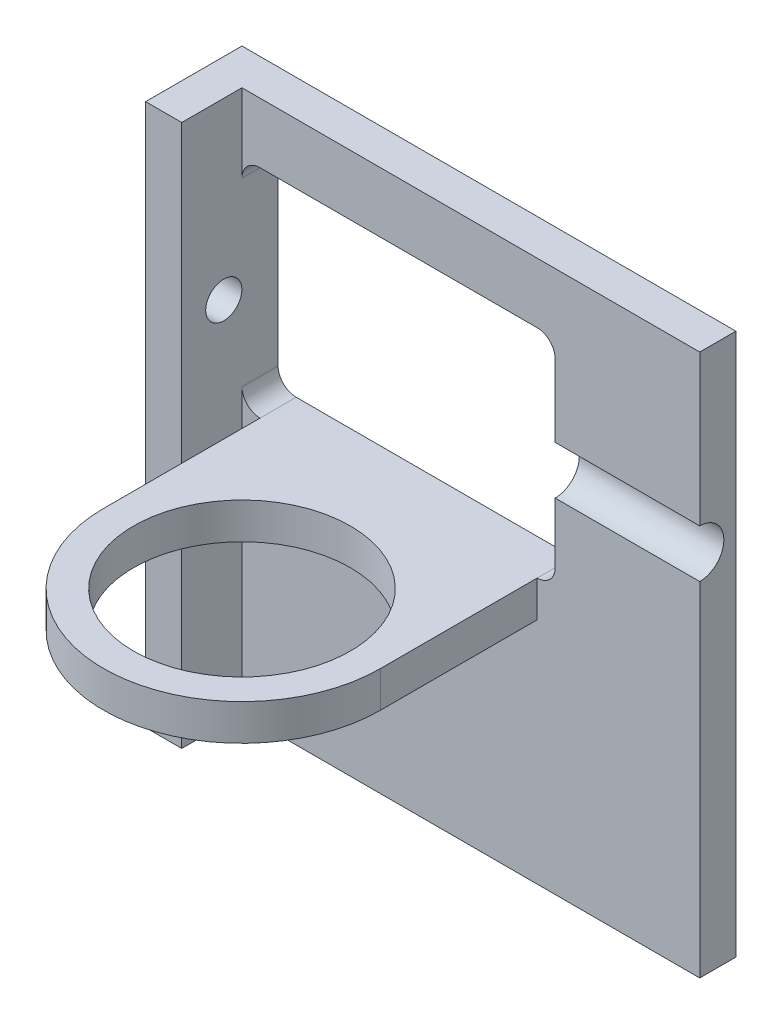
ISO-10303-21;
HEADER;
FILE_DESCRIPTION(('STEP AP214'),'2;1');
FILE_NAME('part.step','',(''),(''),'','','');
FILE_SCHEMA(('AUTOMOTIVE_DESIGN { 1 0 10303 214 1 1 1 1 }'));
ENDSEC;
DATA;
#1=APPLICATION_CONTEXT('core data for automotive mechanical design processes');
#2=APPLICATION_PROTOCOL_DEFINITION('international standard','automotive_design',2000,#1);
#3=PRODUCT_CONTEXT('',#1,'mechanical');
#4=PRODUCT('Part','Part','',(#3));
#5=PRODUCT_RELATED_PRODUCT_CATEGORY('part','',(#4));
#6=PRODUCT_DEFINITION_FORMATION('','',#4);
#7=PRODUCT_DEFINITION_CONTEXT('part definition',#1,'design');
#8=PRODUCT_DEFINITION('design','',#6,#7);
#9=PRODUCT_DEFINITION_SHAPE('','',#8);
#10=(LENGTH_UNIT() NAMED_UNIT(*) SI_UNIT(.MILLI.,.METRE.));
#11=(NAMED_UNIT(*) PLANE_ANGLE_UNIT() SI_UNIT($,.RADIAN.));
#12=(NAMED_UNIT(*) SI_UNIT($,.STERADIAN.) SOLID_ANGLE_UNIT());
#13=UNCERTAINTY_MEASURE_WITH_UNIT(LENGTH_MEASURE(1.E-05),#10,'distance_accuracy_value','');
#14=(GEOMETRIC_REPRESENTATION_CONTEXT(3) GLOBAL_UNCERTAINTY_ASSIGNED_CONTEXT((#13)) GLOBAL_UNIT_ASSIGNED_CONTEXT((#10,
#11,#12)) REPRESENTATION_CONTEXT('',''));
#15=CARTESIAN_POINT('',(0.,0.,0.));
#16=DIRECTION('',(0.,0.,1.));
#17=DIRECTION('',(1.,0.,0.));
#18=AXIS2_PLACEMENT_3D('',#15,#16,#17);
#19=CARTESIAN_POINT('',(0.,0.,3.));
#20=DIRECTION('',(0.,0.,1.));
#21=DIRECTION('',(1.,0.,0.));
#22=AXIS2_PLACEMENT_3D('',#19,#20,#21);
#23=PLANE('',#22);
#24=DIRECTION('',(1.,0.,0.));
#25=VECTOR('',#24,1.);
#26=CARTESIAN_POINT('',(24.5278640450004,-16.5,3.));
#27=LINE('',#26,#25);
#28=CARTESIAN_POINT('',(29.,-16.5,3.));
#29=VERTEX_POINT('',#28);
#30=CARTESIAN_POINT('',(41.,-16.5,3.));
#31=VERTEX_POINT('',#30);
#32=EDGE_CURVE('E171',#29,#31,#27,.T.);
#33=ORIENTED_EDGE('',*,*,#32,.F.);
#34=DIRECTION('',(0.,1.,0.));
#35=VECTOR('',#34,1.);
#36=CARTESIAN_POINT('',(29.,-21.5,3.));
#37=LINE('',#36,#35);
#38=CARTESIAN_POINT('',(29.,-21.5,3.));
#39=VERTEX_POINT('',#38);
#40=EDGE_CURVE('E291',#39,#29,#37,.T.);
#41=ORIENTED_EDGE('',*,*,#40,.F.);
#42=CARTESIAN_POINT('',(27.5,-21.5,3.));
#43=DIRECTION('',(0.,0.,1.));
#44=DIRECTION('',(-1.,0.,0.));
#45=AXIS2_PLACEMENT_3D('',#42,#43,#44);
#46=CIRCLE('',#45,1.5);
#47=CARTESIAN_POINT('',(27.5,-23.,3.));
#48=VERTEX_POINT('',#47);
#49=EDGE_CURVE('E294',#48,#39,#46,.T.);
#50=ORIENTED_EDGE('',*,*,#49,.F.);
#51=DIRECTION('',(0.,1.,0.));
#52=VECTOR('',#51,1.);
#53=CARTESIAN_POINT('',(27.5,-26.,3.));
#54=LINE('',#53,#52);
#55=CARTESIAN_POINT('',(27.5,-26.,3.));
#56=VERTEX_POINT('',#55);
#57=EDGE_CURVE('E323',#56,#48,#54,.T.);
#58=ORIENTED_EDGE('',*,*,#57,.F.);
#59=DIRECTION('',(-1.,0.,0.));
#60=VECTOR('',#59,1.);
#61=CARTESIAN_POINT('',(0.,-26.,3.));
#62=LINE('',#61,#60);
#63=CARTESIAN_POINT('',(4.50000000000002,-26.,3.));
#64=VERTEX_POINT('',#63);
#65=EDGE_CURVE('E321',#56,#64,#62,.T.);
#66=ORIENTED_EDGE('',*,*,#65,.T.);
#67=DIRECTION('',(0.,1.,0.));
#68=VECTOR('',#67,1.);
#69=CARTESIAN_POINT('',(4.50000000000002,-26.,3.));
#70=LINE('',#69,#68);
#71=CARTESIAN_POINT('',(4.50000000000002,-23.,3.));
#72=VERTEX_POINT('',#71);
#73=EDGE_CURVE('E315',#64,#72,#70,.T.);
#74=ORIENTED_EDGE('',*,*,#73,.T.);
#75=CARTESIAN_POINT('',(4.50000000000001,-21.5,3.));
#76=DIRECTION('',(0.,0.,1.));
#77=DIRECTION('',(-1.,0.,0.));
#78=AXIS2_PLACEMENT_3D('',#75,#76,#77);
#79=CIRCLE('',#78,1.5);
#80=CARTESIAN_POINT('',(3.00000000000001,-21.5,3.));
#81=VERTEX_POINT('',#80);
#82=EDGE_CURVE('E296',#81,#72,#79,.T.);
#83=ORIENTED_EDGE('',*,*,#82,.F.);
#84=DIRECTION('',(0.,1.,0.));
#85=VECTOR('',#84,1.);
#86=CARTESIAN_POINT('',(3.,0.,3.));
#87=LINE('',#86,#85);
#88=CARTESIAN_POINT('',(3.,-45.,3.));
#89=VERTEX_POINT('',#88);
#90=EDGE_CURVE('E47',#89,#81,#87,.T.);
#91=ORIENTED_EDGE('',*,*,#90,.F.);
#92=DIRECTION('',(1.,0.,0.));
#93=VECTOR('',#92,1.);
#94=CARTESIAN_POINT('',(0.,-45.,3.));
#95=LINE('',#94,#93);
#96=CARTESIAN_POINT('',(41.,-45.,3.));
#97=VERTEX_POINT('',#96);
#98=EDGE_CURVE('E191',#89,#97,#95,.T.);
#99=ORIENTED_EDGE('',*,*,#98,.T.);
#100=DIRECTION('',(0.,1.,0.));
#101=VECTOR('',#100,1.);
#102=CARTESIAN_POINT('',(41.,0.,3.));
#103=LINE('',#102,#101);
#104=EDGE_CURVE('E190',#97,#31,#103,.T.);
#105=ORIENTED_EDGE('',*,*,#104,.T.);
#106=EDGE_LOOP('',(#33,#41,#50,#58,#66,#74,#83,#91,#99,#105));
#107=FACE_BOUND('',#106,.T.);
#108=ADVANCED_FACE('F37',(#107),#23,.T.);
#109=DIRECTION('',(1.,0.,0.));
#110=VECTOR('',#109,1.);
#111=CARTESIAN_POINT('',(24.5278640450004,-12.5,3.));
#112=LINE('',#111,#110);
#113=CARTESIAN_POINT('',(29.,-12.5,3.));
#114=VERTEX_POINT('',#113);
#115=CARTESIAN_POINT('',(41.,-12.5,3.));
#116=VERTEX_POINT('',#115);
#117=EDGE_CURVE('E54',#114,#116,#112,.T.);
#118=ORIENTED_EDGE('',*,*,#117,.T.);
#119=CARTESIAN_POINT('',(41.,0.,3.));
#120=VERTEX_POINT('',#119);
#121=EDGE_CURVE('E181',#116,#120,#103,.T.);
#122=ORIENTED_EDGE('',*,*,#121,.T.);
#123=DIRECTION('',(-1.,0.,0.));
#124=VECTOR('',#123,1.);
#125=CARTESIAN_POINT('',(0.,0.,3.));
#126=LINE('',#125,#124);
#127=CARTESIAN_POINT('',(3.,0.,3.));
#128=VERTEX_POINT('',#127);
#129=EDGE_CURVE('E193',#120,#128,#126,.T.);
#130=ORIENTED_EDGE('',*,*,#129,.T.);
#131=CARTESIAN_POINT('',(3.00000000000001,-6.50000000000002,3.));
#132=VERTEX_POINT('',#131);
#133=EDGE_CURVE('E11',#132,#128,#87,.T.);
#134=ORIENTED_EDGE('',*,*,#133,.F.);
#135=CARTESIAN_POINT('',(4.50000000000001,-6.5,3.));
#136=DIRECTION('',(0.,0.,1.));
#137=DIRECTION('',(1.,0.,0.));
#138=AXIS2_PLACEMENT_3D('',#135,#136,#137);
#139=CIRCLE('',#138,1.5);
#140=CARTESIAN_POINT('',(4.50000000000002,-5.,3.));
#141=VERTEX_POINT('',#140);
#142=EDGE_CURVE('E267',#141,#132,#139,.T.);
#143=ORIENTED_EDGE('',*,*,#142,.F.);
#144=DIRECTION('',(-1.,0.,0.));
#145=VECTOR('',#144,1.);
#146=CARTESIAN_POINT('',(27.5,-5.,3.));
#147=LINE('',#146,#145);
#148=CARTESIAN_POINT('',(27.5,-5.,3.));
#149=VERTEX_POINT('',#148);
#150=EDGE_CURVE('E263',#149,#141,#147,.T.);
#151=ORIENTED_EDGE('',*,*,#150,.F.);
#152=CARTESIAN_POINT('',(27.5,-6.5,3.));
#153=DIRECTION('',(0.,0.,1.));
#154=DIRECTION('',(1.,0.,0.));
#155=AXIS2_PLACEMENT_3D('',#152,#153,#154);
#156=CIRCLE('',#155,1.5);
#157=CARTESIAN_POINT('',(29.,-6.50000000000001,3.));
#158=VERTEX_POINT('',#157);
#159=EDGE_CURVE('E288',#158,#149,#156,.T.);
#160=ORIENTED_EDGE('',*,*,#159,.F.);
#161=EDGE_CURVE('E184',#114,#158,#37,.T.);
#162=ORIENTED_EDGE('',*,*,#161,.F.);
#163=EDGE_LOOP('',(#118,#122,#130,#134,#143,#151,#160,#162));
#164=FACE_BOUND('',#163,.T.);
#165=ADVANCED_FACE('F180',(#164),#23,.T.);
#166=CARTESIAN_POINT('',(0.,0.,0.));
#167=DIRECTION('',(0.,0.,1.));
#168=DIRECTION('',(1.,0.,0.));
#169=AXIS2_PLACEMENT_3D('',#166,#167,#168);
#170=PLANE('',#169);
#171=DIRECTION('',(0.,-1.,0.));
#172=VECTOR('',#171,1.);
#173=CARTESIAN_POINT('',(0.,0.,0.));
#174=LINE('',#173,#172);
#175=CARTESIAN_POINT('',(0.,0.,0.));
#176=VERTEX_POINT('',#175);
#177=CARTESIAN_POINT('',(0.,-45.,0.));
#178=VERTEX_POINT('',#177);
#179=EDGE_CURVE('E200',#176,#178,#174,.T.);
#180=ORIENTED_EDGE('',*,*,#179,.F.);
#181=DIRECTION('',(-1.,0.,0.));
#182=VECTOR('',#181,1.);
#183=CARTESIAN_POINT('',(0.,0.,0.));
#184=LINE('',#183,#182);
#185=CARTESIAN_POINT('',(41.,0.,0.));
#186=VERTEX_POINT('',#185);
#187=EDGE_CURVE('E194',#186,#176,#184,.T.);
#188=ORIENTED_EDGE('',*,*,#187,.F.);
#189=DIRECTION('',(0.,1.,0.));
#190=VECTOR('',#189,1.);
#191=CARTESIAN_POINT('',(41.,0.,0.));
#192=LINE('',#191,#190);
#193=CARTESIAN_POINT('',(41.,-45.,0.));
#194=VERTEX_POINT('',#193);
#195=EDGE_CURVE('E206',#194,#186,#192,.T.);
#196=ORIENTED_EDGE('',*,*,#195,.F.);
#197=DIRECTION('',(1.,0.,0.));
#198=VECTOR('',#197,1.);
#199=CARTESIAN_POINT('',(0.,-45.,0.));
#200=LINE('',#199,#198);
#201=EDGE_CURVE('E203',#178,#194,#200,.T.);
#202=ORIENTED_EDGE('',*,*,#201,.F.);
#203=EDGE_LOOP('',(#180,#188,#196,#202));
#204=FACE_BOUND('',#203,.T.);
#205=CARTESIAN_POINT('',(4.50000000000001,-6.5,0.));
#206=DIRECTION('',(0.,0.,1.));
#207=DIRECTION('',(1.,0.,0.));
#208=AXIS2_PLACEMENT_3D('',#205,#206,#207);
#209=CIRCLE('',#208,1.5);
#210=CARTESIAN_POINT('',(4.50000000000002,-5.,0.));
#211=VERTEX_POINT('',#210);
#212=CARTESIAN_POINT('',(3.00000000000001,-6.50000000000002,0.));
#213=VERTEX_POINT('',#212);
#214=EDGE_CURVE('E284',#211,#213,#209,.T.);
#215=ORIENTED_EDGE('',*,*,#214,.T.);
#216=DIRECTION('',(0.,-1.,0.));
#217=VECTOR('',#216,1.);
#218=CARTESIAN_POINT('',(3.00000000000001,-21.5,0.));
#219=LINE('',#218,#217);
#220=CARTESIAN_POINT('',(3.00000000000001,-21.5,0.));
#221=VERTEX_POINT('',#220);
#222=EDGE_CURVE('E244',#213,#221,#219,.T.);
#223=ORIENTED_EDGE('',*,*,#222,.T.);
#224=CARTESIAN_POINT('',(4.50000000000001,-21.5,0.));
#225=DIRECTION('',(0.,0.,1.));
#226=DIRECTION('',(-1.,0.,0.));
#227=AXIS2_PLACEMENT_3D('',#224,#225,#226);
#228=CIRCLE('',#227,1.5);
#229=CARTESIAN_POINT('',(4.50000000000002,-23.,0.));
#230=VERTEX_POINT('',#229);
#231=EDGE_CURVE('E280',#221,#230,#228,.T.);
#232=ORIENTED_EDGE('',*,*,#231,.T.);
#233=DIRECTION('',(1.,0.,0.));
#234=VECTOR('',#233,1.);
#235=CARTESIAN_POINT('',(27.5,-23.,0.));
#236=LINE('',#235,#234);
#237=CARTESIAN_POINT('',(27.5,-23.,0.));
#238=VERTEX_POINT('',#237);
#239=EDGE_CURVE('E277',#230,#238,#236,.T.);
#240=ORIENTED_EDGE('',*,*,#239,.T.);
#241=CARTESIAN_POINT('',(27.5,-21.5,0.));
#242=DIRECTION('',(0.,0.,1.));
#243=DIRECTION('',(-1.,0.,0.));
#244=AXIS2_PLACEMENT_3D('',#241,#242,#243);
#245=CIRCLE('',#244,1.5);
#246=CARTESIAN_POINT('',(29.,-21.5,0.));
#247=VERTEX_POINT('',#246);
#248=EDGE_CURVE('E274',#238,#247,#245,.T.);
#249=ORIENTED_EDGE('',*,*,#248,.T.);
#250=DIRECTION('',(0.,1.,0.));
#251=VECTOR('',#250,1.);
#252=CARTESIAN_POINT('',(29.,-21.5,0.));
#253=LINE('',#252,#251);
#254=CARTESIAN_POINT('',(29.,-6.50000000000001,0.));
#255=VERTEX_POINT('',#254);
#256=EDGE_CURVE('E271',#247,#255,#253,.T.);
#257=ORIENTED_EDGE('',*,*,#256,.T.);
#258=CARTESIAN_POINT('',(27.5,-6.5,0.));
#259=DIRECTION('',(0.,0.,1.));
#260=DIRECTION('',(1.,0.,0.));
#261=AXIS2_PLACEMENT_3D('',#258,#259,#260);
#262=CIRCLE('',#261,1.5);
#263=CARTESIAN_POINT('',(27.5,-5.,0.));
#264=VERTEX_POINT('',#263);
#265=EDGE_CURVE('E268',#255,#264,#262,.T.);
#266=ORIENTED_EDGE('',*,*,#265,.T.);
#267=DIRECTION('',(-1.,0.,0.));
#268=VECTOR('',#267,1.);
#269=CARTESIAN_POINT('',(27.5,-5.,0.));
#270=LINE('',#269,#268);
#271=EDGE_CURVE('E264',#264,#211,#270,.T.);
#272=ORIENTED_EDGE('',*,*,#271,.T.);
#273=EDGE_LOOP('',(#215,#223,#232,#240,#249,#257,#266,#272));
#274=FACE_BOUND('',#273,.T.);
#275=ADVANCED_FACE('F229',(#204,#274),#170,.F.);
#276=CARTESIAN_POINT('',(0.,0.,3.));
#277=DIRECTION('',(1.,0.,0.));
#278=DIRECTION('',(0.,1.,0.));
#279=AXIS2_PLACEMENT_3D('',#276,#277,#278);
#280=PLANE('',#279);
#281=ORIENTED_EDGE('',*,*,#179,.T.);
#282=DIRECTION('',(0.,0.,-1.));
#283=VECTOR('',#282,1.);
#284=CARTESIAN_POINT('',(0.,-45.,3.));
#285=LINE('',#284,#283);
#286=CARTESIAN_POINT('',(0.,-45.,7.99999999999999));
#287=VERTEX_POINT('',#286);
#288=EDGE_CURVE('E41',#287,#178,#285,.T.);
#289=ORIENTED_EDGE('',*,*,#288,.F.);
#290=DIRECTION('',(0.,-1.,0.));
#291=VECTOR('',#290,1.);
#292=CARTESIAN_POINT('',(0.,0.,8.));
#293=LINE('',#292,#291);
#294=CARTESIAN_POINT('',(0.,0.,8.));
#295=VERTEX_POINT('',#294);
#296=EDGE_CURVE('E304',#295,#287,#293,.T.);
#297=ORIENTED_EDGE('',*,*,#296,.F.);
#298=DIRECTION('',(0.,0.,-1.));
#299=VECTOR('',#298,1.);
#300=CARTESIAN_POINT('',(0.,0.,3.));
#301=LINE('',#300,#299);
#302=EDGE_CURVE('E199',#295,#176,#301,.T.);
#303=ORIENTED_EDGE('',*,*,#302,.T.);
#304=EDGE_LOOP('',(#281,#289,#297,#303));
#305=FACE_BOUND('',#304,.T.);
#306=CARTESIAN_POINT('',(0.,-14.5,4.51));
#307=DIRECTION('',(1.,0.,0.));
#308=DIRECTION('',(0.,0.,-1.));
#309=AXIS2_PLACEMENT_3D('',#306,#307,#308);
#310=CIRCLE('',#309,1.5);
#311=CARTESIAN_POINT('',(0.,-14.5,3.01));
#312=VERTEX_POINT('',#311);
#313=EDGE_CURVE('E312',#312,#312,#310,.T.);
#314=ORIENTED_EDGE('',*,*,#313,.T.);
#315=EDGE_LOOP('',(#314));
#316=FACE_BOUND('',#315,.T.);
#317=ADVANCED_FACE('F39',(#305,#316),#280,.F.);
#318=CARTESIAN_POINT('',(0.,-45.,3.));
#319=DIRECTION('',(0.,1.,0.));
#320=DIRECTION('',(0.,0.,1.));
#321=AXIS2_PLACEMENT_3D('',#318,#319,#320);
#322=PLANE('',#321);
#323=ORIENTED_EDGE('',*,*,#201,.T.);
#324=DIRECTION('',(0.,0.,-1.));
#325=VECTOR('',#324,1.);
#326=CARTESIAN_POINT('',(41.,-45.,3.));
#327=LINE('',#326,#325);
#328=EDGE_CURVE('E211',#97,#194,#327,.T.);
#329=ORIENTED_EDGE('',*,*,#328,.F.);
#330=ORIENTED_EDGE('',*,*,#98,.F.);
#331=DIRECTION('',(0.,0.,-1.));
#332=VECTOR('',#331,1.);
#333=CARTESIAN_POINT('',(3.,-45.,3.));
#334=LINE('',#333,#332);
#335=CARTESIAN_POINT('',(3.,-45.,7.99999999999999));
#336=VERTEX_POINT('',#335);
#337=EDGE_CURVE('E303',#336,#89,#334,.T.);
#338=ORIENTED_EDGE('',*,*,#337,.F.);
#339=DIRECTION('',(-1.,0.,0.));
#340=VECTOR('',#339,1.);
#341=CARTESIAN_POINT('',(3.,-45.,7.99999999999999));
#342=LINE('',#341,#340);
#343=EDGE_CURVE('E221',#336,#287,#342,.T.);
#344=ORIENTED_EDGE('',*,*,#343,.T.);
#345=ORIENTED_EDGE('',*,*,#288,.T.);
#346=EDGE_LOOP('',(#323,#329,#330,#338,#344,#345));
#347=FACE_BOUND('',#346,.T.);
#348=ADVANCED_FACE('F218',(#347),#322,.F.);
#349=CARTESIAN_POINT('',(41.,0.,3.));
#350=DIRECTION('',(-1.,0.,0.));
#351=DIRECTION('',(0.,-1.,0.));
#352=AXIS2_PLACEMENT_3D('',#349,#350,#351);
#353=PLANE('',#352);
#354=ORIENTED_EDGE('',*,*,#121,.F.);
#355=CARTESIAN_POINT('',(41.,-14.5,3.));
#356=DIRECTION('',(1.,0.,0.));
#357=DIRECTION('',(0.,1.,0.));
#358=AXIS2_PLACEMENT_3D('',#355,#356,#357);
#359=CIRCLE('',#358,2.);
#360=EDGE_CURVE('E168',#31,#116,#359,.T.);
#361=ORIENTED_EDGE('',*,*,#360,.F.);
#362=ORIENTED_EDGE('',*,*,#104,.F.);
#363=ORIENTED_EDGE('',*,*,#328,.T.);
#364=ORIENTED_EDGE('',*,*,#195,.T.);
#365=DIRECTION('',(0.,0.,-1.));
#366=VECTOR('',#365,1.);
#367=CARTESIAN_POINT('',(41.,0.,3.));
#368=LINE('',#367,#366);
#369=EDGE_CURVE('E188',#120,#186,#368,.T.);
#370=ORIENTED_EDGE('',*,*,#369,.F.);
#371=EDGE_LOOP('',(#354,#361,#362,#363,#364,#370));
#372=FACE_BOUND('',#371,.T.);
#373=ADVANCED_FACE('F186',(#372),#353,.F.);
#374=CARTESIAN_POINT('',(0.,0.,3.));
#375=DIRECTION('',(0.,-1.,0.));
#376=DIRECTION('',(0.,0.,-1.));
#377=AXIS2_PLACEMENT_3D('',#374,#375,#376);
#378=PLANE('',#377);
#379=ORIENTED_EDGE('',*,*,#187,.T.);
#380=ORIENTED_EDGE('',*,*,#302,.F.);
#381=DIRECTION('',(-1.,0.,0.));
#382=VECTOR('',#381,1.);
#383=CARTESIAN_POINT('',(3.,0.,8.));
#384=LINE('',#383,#382);
#385=CARTESIAN_POINT('',(3.,0.,8.));
#386=VERTEX_POINT('',#385);
#387=EDGE_CURVE('E286',#386,#295,#384,.T.);
#388=ORIENTED_EDGE('',*,*,#387,.F.);
#389=DIRECTION('',(0.,0.,1.));
#390=VECTOR('',#389,1.);
#391=CARTESIAN_POINT('',(3.,0.,3.));
#392=LINE('',#391,#390);
#393=EDGE_CURVE('E235',#128,#386,#392,.T.);
#394=ORIENTED_EDGE('',*,*,#393,.F.);
#395=ORIENTED_EDGE('',*,*,#129,.F.);
#396=ORIENTED_EDGE('',*,*,#369,.T.);
#397=EDGE_LOOP('',(#379,#380,#388,#394,#395,#396));
#398=FACE_BOUND('',#397,.T.);
#399=ADVANCED_FACE('F232',(#398),#378,.F.);
#400=CARTESIAN_POINT('',(4.50000000000001,-6.5,3.));
#401=DIRECTION('',(0.,0.,-1.));
#402=DIRECTION('',(-1.,0.,0.));
#403=AXIS2_PLACEMENT_3D('',#400,#401,#402);
#404=CYLINDRICAL_SURFACE('',#403,1.5);
#405=ORIENTED_EDGE('',*,*,#214,.F.);
#406=DIRECTION('',(0.,0.,-1.));
#407=VECTOR('',#406,1.);
#408=CARTESIAN_POINT('',(4.50000000000002,-5.,3.));
#409=LINE('',#408,#407);
#410=EDGE_CURVE('E260',#141,#211,#409,.T.);
#411=ORIENTED_EDGE('',*,*,#410,.F.);
#412=ORIENTED_EDGE('',*,*,#142,.T.);
#413=DIRECTION('',(0.,0.,-1.));
#414=VECTOR('',#413,1.);
#415=CARTESIAN_POINT('',(3.00000000000001,-6.50000000000002,3.));
#416=LINE('',#415,#414);
#417=EDGE_CURVE('E204',#132,#213,#416,.T.);
#418=ORIENTED_EDGE('',*,*,#417,.T.);
#419=EDGE_LOOP('',(#405,#411,#412,#418));
#420=FACE_BOUND('',#419,.T.);
#421=ADVANCED_FACE('F384',(#420),#404,.F.);
#422=CARTESIAN_POINT('',(3.00000000000001,-21.5,3.));
#423=DIRECTION('',(1.,0.,0.));
#424=DIRECTION('',(0.,0.,-1.));
#425=AXIS2_PLACEMENT_3D('',#422,#423,#424);
#426=PLANE('',#425);
#427=ORIENTED_EDGE('',*,*,#222,.F.);
#428=ORIENTED_EDGE('',*,*,#417,.F.);
#429=ORIENTED_EDGE('',*,*,#133,.T.);
#430=ORIENTED_EDGE('',*,*,#393,.T.);
#431=DIRECTION('',(0.,-1.,0.));
#432=VECTOR('',#431,1.);
#433=CARTESIAN_POINT('',(3.,0.,8.));
#434=LINE('',#433,#432);
#435=EDGE_CURVE('E309',#386,#336,#434,.T.);
#436=ORIENTED_EDGE('',*,*,#435,.T.);
#437=ORIENTED_EDGE('',*,*,#337,.T.);
#438=ORIENTED_EDGE('',*,*,#90,.T.);
#439=DIRECTION('',(0.,0.,-1.));
#440=VECTOR('',#439,1.);
#441=CARTESIAN_POINT('',(3.00000000000001,-21.5,3.));
#442=LINE('',#441,#440);
#443=EDGE_CURVE('E247',#81,#221,#442,.T.);
#444=ORIENTED_EDGE('',*,*,#443,.T.);
#445=EDGE_LOOP('',(#427,#428,#429,#430,#436,#437,#438,#444));
#446=FACE_BOUND('',#445,.T.);
#447=CARTESIAN_POINT('',(3.,-14.5,4.51));
#448=DIRECTION('',(1.,0.,0.));
#449=DIRECTION('',(0.,0.,-1.));
#450=AXIS2_PLACEMENT_3D('',#447,#448,#449);
#451=CIRCLE('',#450,1.5);
#452=CARTESIAN_POINT('',(3.,-14.5,3.01));
#453=VERTEX_POINT('',#452);
#454=EDGE_CURVE('E306',#453,#453,#451,.T.);
#455=ORIENTED_EDGE('',*,*,#454,.F.);
#456=EDGE_LOOP('',(#455));
#457=FACE_BOUND('',#456,.T.);
#458=ADVANCED_FACE('F240',(#446,#457),#426,.T.);
#459=CARTESIAN_POINT('',(4.50000000000001,-21.5,3.));
#460=DIRECTION('',(0.,0.,-1.));
#461=DIRECTION('',(-1.,0.,0.));
#462=AXIS2_PLACEMENT_3D('',#459,#460,#461);
#463=CYLINDRICAL_SURFACE('',#462,1.5);
#464=ORIENTED_EDGE('',*,*,#231,.F.);
#465=ORIENTED_EDGE('',*,*,#443,.F.);
#466=ORIENTED_EDGE('',*,*,#82,.T.);
#467=DIRECTION('',(0.,0.,-1.));
#468=VECTOR('',#467,1.);
#469=CARTESIAN_POINT('',(4.50000000000002,-23.,3.));
#470=LINE('',#469,#468);
#471=EDGE_CURVE('E248',#72,#230,#470,.T.);
#472=ORIENTED_EDGE('',*,*,#471,.T.);
#473=EDGE_LOOP('',(#464,#465,#466,#472));
#474=FACE_BOUND('',#473,.T.);
#475=ADVANCED_FACE('F493',(#474),#463,.F.);
#476=CARTESIAN_POINT('',(27.5,-23.,3.));
#477=DIRECTION('',(0.,1.,0.));
#478=DIRECTION('',(-1.,0.,0.));
#479=AXIS2_PLACEMENT_3D('',#476,#477,#478);
#480=PLANE('',#479);
#481=ORIENTED_EDGE('',*,*,#239,.F.);
#482=ORIENTED_EDGE('',*,*,#471,.F.);
#483=DIRECTION('',(0.,0.,1.));
#484=VECTOR('',#483,1.);
#485=CARTESIAN_POINT('',(4.50000000000002,-23.,0.));
#486=LINE('',#485,#484);
#487=CARTESIAN_POINT('',(4.50000000000002,-23.,16.));
#488=VERTEX_POINT('',#487);
#489=EDGE_CURVE('E335',#72,#488,#486,.T.);
#490=ORIENTED_EDGE('',*,*,#489,.T.);
#491=CARTESIAN_POINT('',(16.,-23.,16.));
#492=DIRECTION('',(0.,1.,0.));
#493=DIRECTION('',(0.,0.,1.));
#494=AXIS2_PLACEMENT_3D('',#491,#492,#493);
#495=CIRCLE('',#494,11.5);
#496=CARTESIAN_POINT('',(27.5,-23.,16.));
#497=VERTEX_POINT('',#496);
#498=EDGE_CURVE('E332',#488,#497,#495,.T.);
#499=ORIENTED_EDGE('',*,*,#498,.T.);
#500=DIRECTION('',(0.,0.,1.));
#501=VECTOR('',#500,1.);
#502=CARTESIAN_POINT('',(27.5,-23.,0.));
#503=LINE('',#502,#501);
#504=EDGE_CURVE('E328',#48,#497,#503,.T.);
#505=ORIENTED_EDGE('',*,*,#504,.F.);
#506=DIRECTION('',(0.,0.,-1.));
#507=VECTOR('',#506,1.);
#508=CARTESIAN_POINT('',(27.5,-23.,3.));
#509=LINE('',#508,#507);
#510=EDGE_CURVE('E252',#48,#238,#509,.T.);
#511=ORIENTED_EDGE('',*,*,#510,.T.);
#512=EDGE_LOOP('',(#481,#482,#490,#499,#505,#511));
#513=FACE_BOUND('',#512,.T.);
#514=CARTESIAN_POINT('',(16.,-23.,16.));
#515=DIRECTION('',(0.,1.,0.));
#516=DIRECTION('',(0.,0.,1.));
#517=AXIS2_PLACEMENT_3D('',#514,#515,#516);
#518=CIRCLE('',#517,9.);
#519=CARTESIAN_POINT('',(16.,-23.,25.));
#520=VERTEX_POINT('',#519);
#521=EDGE_CURVE('E338',#520,#520,#518,.T.);
#522=ORIENTED_EDGE('',*,*,#521,.F.);
#523=EDGE_LOOP('',(#522));
#524=FACE_BOUND('',#523,.T.);
#525=ADVANCED_FACE('F498',(#513,#524),#480,.T.);
#526=CARTESIAN_POINT('',(27.5,-21.5,3.));
#527=DIRECTION('',(0.,0.,-1.));
#528=DIRECTION('',(-1.,0.,0.));
#529=AXIS2_PLACEMENT_3D('',#526,#527,#528);
#530=CYLINDRICAL_SURFACE('',#529,1.5);
#531=ORIENTED_EDGE('',*,*,#248,.F.);
#532=ORIENTED_EDGE('',*,*,#510,.F.);
#533=ORIENTED_EDGE('',*,*,#49,.T.);
#534=DIRECTION('',(0.,0.,-1.));
#535=VECTOR('',#534,1.);
#536=CARTESIAN_POINT('',(29.,-21.5,3.));
#537=LINE('',#536,#535);
#538=EDGE_CURVE('E254',#39,#247,#537,.T.);
#539=ORIENTED_EDGE('',*,*,#538,.T.);
#540=EDGE_LOOP('',(#531,#532,#533,#539));
#541=FACE_BOUND('',#540,.T.);
#542=ADVANCED_FACE('F427',(#541),#530,.F.);
#543=CARTESIAN_POINT('',(29.,-21.5,3.));
#544=DIRECTION('',(-1.,0.,0.));
#545=DIRECTION('',(0.,0.,1.));
#546=AXIS2_PLACEMENT_3D('',#543,#544,#545);
#547=PLANE('',#546);
#548=CARTESIAN_POINT('',(29.,-14.5,3.));
#549=DIRECTION('',(-1.,0.,0.));
#550=DIRECTION('',(0.,0.,1.));
#551=AXIS2_PLACEMENT_3D('',#548,#549,#550);
#552=CIRCLE('',#551,2.);
#553=EDGE_CURVE('E176',#29,#114,#552,.F.);
#554=ORIENTED_EDGE('',*,*,#553,.T.);
#555=ORIENTED_EDGE('',*,*,#161,.T.);
#556=DIRECTION('',(0.,0.,-1.));
#557=VECTOR('',#556,1.);
#558=CARTESIAN_POINT('',(29.,-6.50000000000001,3.));
#559=LINE('',#558,#557);
#560=EDGE_CURVE('E256',#158,#255,#559,.T.);
#561=ORIENTED_EDGE('',*,*,#560,.T.);
#562=ORIENTED_EDGE('',*,*,#256,.F.);
#563=ORIENTED_EDGE('',*,*,#538,.F.);
#564=ORIENTED_EDGE('',*,*,#40,.T.);
#565=EDGE_LOOP('',(#554,#555,#561,#562,#563,#564));
#566=FACE_BOUND('',#565,.T.);
#567=ADVANCED_FACE('F355',(#566),#547,.T.);
#568=CARTESIAN_POINT('',(27.5,-6.5,3.));
#569=DIRECTION('',(0.,0.,-1.));
#570=DIRECTION('',(-1.,0.,0.));
#571=AXIS2_PLACEMENT_3D('',#568,#569,#570);
#572=CYLINDRICAL_SURFACE('',#571,1.5);
#573=ORIENTED_EDGE('',*,*,#265,.F.);
#574=ORIENTED_EDGE('',*,*,#560,.F.);
#575=ORIENTED_EDGE('',*,*,#159,.T.);
#576=DIRECTION('',(0.,0.,-1.));
#577=VECTOR('',#576,1.);
#578=CARTESIAN_POINT('',(27.5,-5.,3.));
#579=LINE('',#578,#577);
#580=EDGE_CURVE('E258',#149,#264,#579,.T.);
#581=ORIENTED_EDGE('',*,*,#580,.T.);
#582=EDGE_LOOP('',(#573,#574,#575,#581));
#583=FACE_BOUND('',#582,.T.);
#584=ADVANCED_FACE('F374',(#583),#572,.F.);
#585=CARTESIAN_POINT('',(27.5,-5.,3.));
#586=DIRECTION('',(0.,-1.,0.));
#587=DIRECTION('',(1.,0.,0.));
#588=AXIS2_PLACEMENT_3D('',#585,#586,#587);
#589=PLANE('',#588);
#590=ORIENTED_EDGE('',*,*,#271,.F.);
#591=ORIENTED_EDGE('',*,*,#580,.F.);
#592=ORIENTED_EDGE('',*,*,#150,.T.);
#593=ORIENTED_EDGE('',*,*,#410,.T.);
#594=EDGE_LOOP('',(#590,#591,#592,#593));
#595=FACE_BOUND('',#594,.T.);
#596=ADVANCED_FACE('F365',(#595),#589,.T.);
#597=CARTESIAN_POINT('',(3.,0.,8.));
#598=DIRECTION('',(0.,0.,-1.));
#599=DIRECTION('',(0.,1.,0.));
#600=AXIS2_PLACEMENT_3D('',#597,#598,#599);
#601=PLANE('',#600);
#602=ORIENTED_EDGE('',*,*,#296,.T.);
#603=ORIENTED_EDGE('',*,*,#343,.F.);
#604=ORIENTED_EDGE('',*,*,#435,.F.);
#605=ORIENTED_EDGE('',*,*,#387,.T.);
#606=EDGE_LOOP('',(#602,#603,#604,#605));
#607=FACE_BOUND('',#606,.T.);
#608=ADVANCED_FACE('F362',(#607),#601,.F.);
#609=CARTESIAN_POINT('',(3.,-14.5,4.51));
#610=DIRECTION('',(-1.,0.,0.));
#611=DIRECTION('',(0.,0.,1.));
#612=AXIS2_PLACEMENT_3D('',#609,#610,#611);
#613=CYLINDRICAL_SURFACE('',#612,1.5);
#614=ORIENTED_EDGE('',*,*,#454,.T.);
#615=EDGE_LOOP('',(#614));
#616=FACE_BOUND('',#615,.T.);
#617=ORIENTED_EDGE('',*,*,#313,.F.);
#618=EDGE_LOOP('',(#617));
#619=FACE_BOUND('',#618,.T.);
#620=ADVANCED_FACE('F364',(#616,#619),#613,.F.);
#621=CARTESIAN_POINT('',(4.50000000000002,-26.,0.));
#622=DIRECTION('',(-1.,0.,0.));
#623=DIRECTION('',(0.,0.,1.));
#624=AXIS2_PLACEMENT_3D('',#621,#622,#623);
#625=PLANE('',#624);
#626=ORIENTED_EDGE('',*,*,#489,.F.);
#627=ORIENTED_EDGE('',*,*,#73,.F.);
#628=DIRECTION('',(0.,0.,1.));
#629=VECTOR('',#628,1.);
#630=CARTESIAN_POINT('',(4.50000000000002,-26.,0.));
#631=LINE('',#630,#629);
#632=CARTESIAN_POINT('',(4.50000000000002,-26.,16.));
#633=VERTEX_POINT('',#632);
#634=EDGE_CURVE('E348',#64,#633,#631,.T.);
#635=ORIENTED_EDGE('',*,*,#634,.T.);
#636=DIRECTION('',(0.,1.,0.));
#637=VECTOR('',#636,1.);
#638=CARTESIAN_POINT('',(4.50000000000002,-26.,16.));
#639=LINE('',#638,#637);
#640=EDGE_CURVE('E318',#633,#488,#639,.T.);
#641=ORIENTED_EDGE('',*,*,#640,.T.);
#642=EDGE_LOOP('',(#626,#627,#635,#641));
#643=FACE_BOUND('',#642,.T.);
#644=ADVANCED_FACE('F371',(#643),#625,.T.);
#645=CARTESIAN_POINT('',(27.5,-26.,0.));
#646=DIRECTION('',(-1.,0.,0.));
#647=DIRECTION('',(0.,0.,1.));
#648=AXIS2_PLACEMENT_3D('',#645,#646,#647);
#649=PLANE('',#648);
#650=ORIENTED_EDGE('',*,*,#504,.T.);
#651=DIRECTION('',(0.,1.,0.));
#652=VECTOR('',#651,1.);
#653=CARTESIAN_POINT('',(27.5,-26.,16.));
#654=LINE('',#653,#652);
#655=CARTESIAN_POINT('',(27.5,-26.,16.));
#656=VERTEX_POINT('',#655);
#657=EDGE_CURVE('E320',#656,#497,#654,.T.);
#658=ORIENTED_EDGE('',*,*,#657,.F.);
#659=DIRECTION('',(0.,0.,1.));
#660=VECTOR('',#659,1.);
#661=CARTESIAN_POINT('',(27.5,-26.,0.));
#662=LINE('',#661,#660);
#663=EDGE_CURVE('E343',#56,#656,#662,.T.);
#664=ORIENTED_EDGE('',*,*,#663,.F.);
#665=ORIENTED_EDGE('',*,*,#57,.T.);
#666=EDGE_LOOP('',(#650,#658,#664,#665));
#667=FACE_BOUND('',#666,.T.);
#668=ADVANCED_FACE('F463',(#667),#649,.F.);
#669=CARTESIAN_POINT('',(16.,-26.,16.));
#670=DIRECTION('',(0.,1.,0.));
#671=DIRECTION('',(0.,0.,1.));
#672=AXIS2_PLACEMENT_3D('',#669,#670,#671);
#673=CYLINDRICAL_SURFACE('',#672,9.);
#674=CARTESIAN_POINT('',(16.,-26.,16.));
#675=DIRECTION('',(0.,1.,0.));
#676=DIRECTION('',(0.,0.,1.));
#677=AXIS2_PLACEMENT_3D('',#674,#675,#676);
#678=CIRCLE('',#677,9.);
#679=CARTESIAN_POINT('',(16.,-26.,25.));
#680=VERTEX_POINT('',#679);
#681=EDGE_CURVE('E331',#680,#680,#678,.T.);
#682=ORIENTED_EDGE('',*,*,#681,.F.);
#683=EDGE_LOOP('',(#682));
#684=FACE_BOUND('',#683,.T.);
#685=ORIENTED_EDGE('',*,*,#521,.T.);
#686=EDGE_LOOP('',(#685));
#687=FACE_BOUND('',#686,.T.);
#688=ADVANCED_FACE('F455',(#684,#687),#673,.F.);
#689=CARTESIAN_POINT('',(16.,-26.,16.));
#690=DIRECTION('',(0.,1.,0.));
#691=DIRECTION('',(0.,0.,1.));
#692=AXIS2_PLACEMENT_3D('',#689,#690,#691);
#693=CYLINDRICAL_SURFACE('',#692,11.5);
#694=ORIENTED_EDGE('',*,*,#498,.F.);
#695=ORIENTED_EDGE('',*,*,#640,.F.);
#696=CARTESIAN_POINT('',(16.,-26.,16.));
#697=DIRECTION('',(0.,1.,0.));
#698=DIRECTION('',(0.,0.,1.));
#699=AXIS2_PLACEMENT_3D('',#696,#697,#698);
#700=CIRCLE('',#699,11.5);
#701=EDGE_CURVE('E345',#633,#656,#700,.T.);
#702=ORIENTED_EDGE('',*,*,#701,.T.);
#703=ORIENTED_EDGE('',*,*,#657,.T.);
#704=EDGE_LOOP('',(#694,#695,#702,#703));
#705=FACE_BOUND('',#704,.T.);
#706=ADVANCED_FACE('F447',(#705),#693,.T.);
#707=CARTESIAN_POINT('',(0.,-26.,0.));
#708=DIRECTION('',(0.,1.,0.));
#709=DIRECTION('',(0.,0.,1.));
#710=AXIS2_PLACEMENT_3D('',#707,#708,#709);
#711=PLANE('',#710);
#712=ORIENTED_EDGE('',*,*,#681,.T.);
#713=EDGE_LOOP('',(#712));
#714=FACE_BOUND('',#713,.T.);
#715=ORIENTED_EDGE('',*,*,#634,.F.);
#716=ORIENTED_EDGE('',*,*,#65,.F.);
#717=ORIENTED_EDGE('',*,*,#663,.T.);
#718=ORIENTED_EDGE('',*,*,#701,.F.);
#719=EDGE_LOOP('',(#715,#716,#717,#718));
#720=FACE_BOUND('',#719,.T.);
#721=ADVANCED_FACE('F439',(#714,#720),#711,.F.);
#722=CARTESIAN_POINT('',(24.5278640450004,-14.5,3.));
#723=DIRECTION('',(1.,0.,0.));
#724=DIRECTION('',(0.,1.,0.));
#725=AXIS2_PLACEMENT_3D('',#722,#723,#724);
#726=CYLINDRICAL_SURFACE('',#725,2.);
#727=ORIENTED_EDGE('',*,*,#32,.T.);
#728=ORIENTED_EDGE('',*,*,#360,.T.);
#729=ORIENTED_EDGE('',*,*,#117,.F.);
#730=ORIENTED_EDGE('',*,*,#553,.F.);
#731=EDGE_LOOP('',(#727,#728,#729,#730));
#732=FACE_BOUND('',#731,.T.);
#733=ADVANCED_FACE('F169',(#732),#726,.F.);
#734=CLOSED_SHELL('',(#108,#165,#275,#317,#348,#373,#399,#421,#458,#475,#525,#542,#567,#584,
#596,#608,#620,#644,#668,#688,#706,#721,#733));
#735=MANIFOLD_SOLID_BREP('B2',#734);
#736=ADVANCED_BREP_SHAPE_REPRESENTATION('',(#18,#735),#14);
#737=SHAPE_DEFINITION_REPRESENTATION(#9,#736);
ENDSEC;
END-ISO-10303-21;
